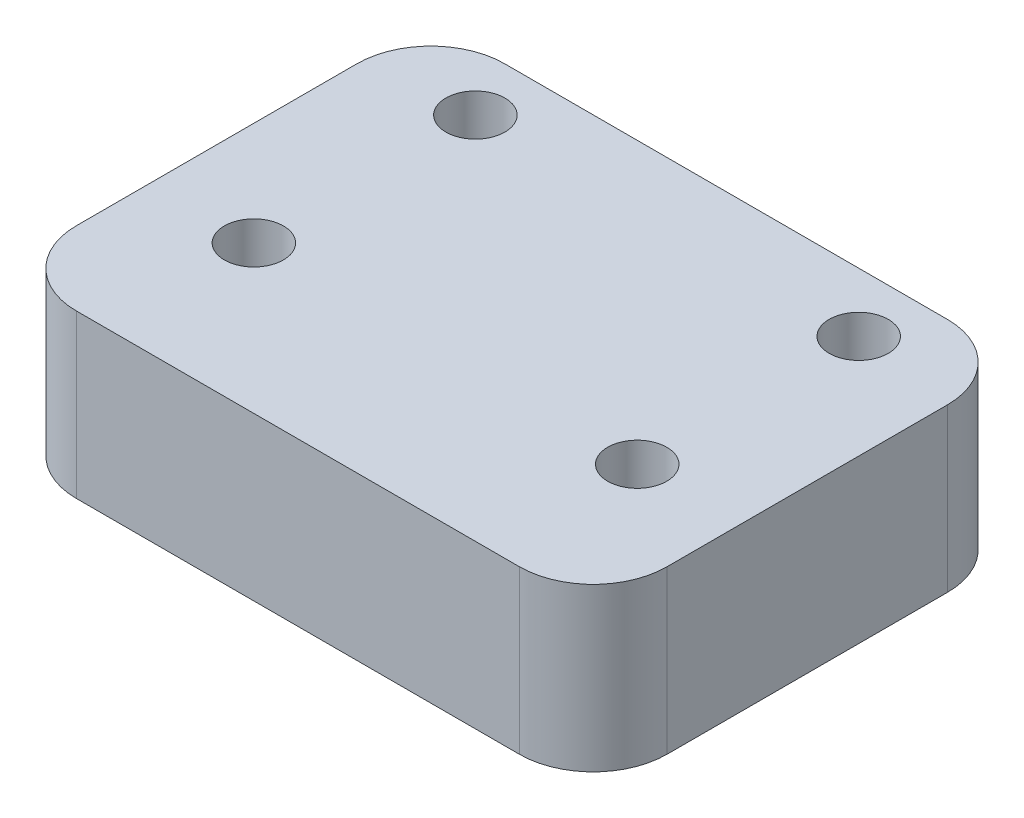
ISO-10303-21;
HEADER;
FILE_DESCRIPTION(('STEP AP214'),'2;1');
FILE_NAME('part.step','',(''),(''),'','','');
FILE_SCHEMA(('AUTOMOTIVE_DESIGN { 1 0 10303 214 1 1 1 1 }'));
ENDSEC;
DATA;
#1=APPLICATION_CONTEXT('core data for automotive mechanical design processes');
#2=APPLICATION_PROTOCOL_DEFINITION('international standard','automotive_design',2000,#1);
#3=PRODUCT_CONTEXT('',#1,'mechanical');
#4=PRODUCT('Part','Part','',(#3));
#5=PRODUCT_RELATED_PRODUCT_CATEGORY('part','',(#4));
#6=PRODUCT_DEFINITION_FORMATION('','',#4);
#7=PRODUCT_DEFINITION_CONTEXT('part definition',#1,'design');
#8=PRODUCT_DEFINITION('design','',#6,#7);
#9=PRODUCT_DEFINITION_SHAPE('','',#8);
#10=(LENGTH_UNIT() NAMED_UNIT(*) SI_UNIT(.MILLI.,.METRE.));
#11=(NAMED_UNIT(*) PLANE_ANGLE_UNIT() SI_UNIT($,.RADIAN.));
#12=(NAMED_UNIT(*) SI_UNIT($,.STERADIAN.) SOLID_ANGLE_UNIT());
#13=UNCERTAINTY_MEASURE_WITH_UNIT(LENGTH_MEASURE(1.E-05),#10,'distance_accuracy_value','');
#14=(GEOMETRIC_REPRESENTATION_CONTEXT(3) GLOBAL_UNCERTAINTY_ASSIGNED_CONTEXT((#13)) GLOBAL_UNIT_ASSIGNED_CONTEXT((#10,
#11,#12)) REPRESENTATION_CONTEXT('',''));
#15=CARTESIAN_POINT('',(0.,0.,0.));
#16=DIRECTION('',(0.,0.,1.));
#17=DIRECTION('',(1.,0.,0.));
#18=AXIS2_PLACEMENT_3D('',#15,#16,#17);
#19=CARTESIAN_POINT('',(0.,11.,0.));
#20=DIRECTION('',(0.,1.,0.));
#21=DIRECTION('',(0.,0.,1.));
#22=AXIS2_PLACEMENT_3D('',#19,#20,#21);
#23=PLANE('',#22);
#24=CARTESIAN_POINT('',(-12.98,11.,4.50000000000001));
#25=DIRECTION('',(0.,1.,0.));
#26=DIRECTION('',(0.,0.,1.));
#27=AXIS2_PLACEMENT_3D('',#24,#25,#26);
#28=CIRCLE('',#27,2.);
#29=CARTESIAN_POINT('',(-12.98,11.,6.50000000000001));
#30=VERTEX_POINT('',#29);
#31=EDGE_CURVE('E180',#30,#30,#28,.T.);
#32=ORIENTED_EDGE('',*,*,#31,.F.);
#33=EDGE_LOOP('',(#32));
#34=FACE_BOUND('',#33,.T.);
#35=CARTESIAN_POINT('',(12.98,11.,-10.5));
#36=DIRECTION('',(0.,1.,0.));
#37=DIRECTION('',(0.,0.,1.));
#38=AXIS2_PLACEMENT_3D('',#35,#36,#37);
#39=CIRCLE('',#38,2.);
#40=CARTESIAN_POINT('',(12.98,11.,-8.49999999999999));
#41=VERTEX_POINT('',#40);
#42=EDGE_CURVE('E163',#41,#41,#39,.T.);
#43=ORIENTED_EDGE('',*,*,#42,.F.);
#44=EDGE_LOOP('',(#43));
#45=FACE_BOUND('',#44,.T.);
#46=DIRECTION('',(0.,0.,1.));
#47=VECTOR('',#46,1.);
#48=CARTESIAN_POINT('',(-20.,11.,-14.5));
#49=LINE('',#48,#47);
#50=CARTESIAN_POINT('',(-20.,11.,-9.5));
#51=VERTEX_POINT('',#50);
#52=CARTESIAN_POINT('',(-20.,11.,9.49999999999999));
#53=VERTEX_POINT('',#52);
#54=EDGE_CURVE('E167',#51,#53,#49,.T.);
#55=ORIENTED_EDGE('',*,*,#54,.T.);
#56=CARTESIAN_POINT('',(-15.,11.,9.5));
#57=DIRECTION('',(0.,1.,0.));
#58=DIRECTION('',(0.,0.,1.));
#59=AXIS2_PLACEMENT_3D('',#56,#57,#58);
#60=CIRCLE('',#59,5.);
#61=CARTESIAN_POINT('',(-15.,11.,14.5));
#62=VERTEX_POINT('',#61);
#63=EDGE_CURVE('E150',#53,#62,#60,.T.);
#64=ORIENTED_EDGE('',*,*,#63,.T.);
#65=DIRECTION('',(1.,0.,0.));
#66=VECTOR('',#65,1.);
#67=CARTESIAN_POINT('',(-20.,11.,14.5));
#68=LINE('',#67,#66);
#69=CARTESIAN_POINT('',(15.,11.,14.5));
#70=VERTEX_POINT('',#69);
#71=EDGE_CURVE('E121',#62,#70,#68,.T.);
#72=ORIENTED_EDGE('',*,*,#71,.T.);
#73=CARTESIAN_POINT('',(15.,11.,9.5));
#74=DIRECTION('',(0.,1.,0.));
#75=DIRECTION('',(0.,0.,1.));
#76=AXIS2_PLACEMENT_3D('',#73,#74,#75);
#77=CIRCLE('',#76,5.);
#78=CARTESIAN_POINT('',(20.,11.,9.49999999999999));
#79=VERTEX_POINT('',#78);
#80=EDGE_CURVE('E148',#70,#79,#77,.T.);
#81=ORIENTED_EDGE('',*,*,#80,.T.);
#82=DIRECTION('',(0.,0.,-1.));
#83=VECTOR('',#82,1.);
#84=CARTESIAN_POINT('',(20.,11.,-14.5));
#85=LINE('',#84,#83);
#86=CARTESIAN_POINT('',(20.,11.,-9.5));
#87=VERTEX_POINT('',#86);
#88=EDGE_CURVE('E128',#79,#87,#85,.T.);
#89=ORIENTED_EDGE('',*,*,#88,.T.);
#90=CARTESIAN_POINT('',(15.,11.,-9.5));
#91=DIRECTION('',(0.,1.,0.));
#92=DIRECTION('',(0.,0.,1.));
#93=AXIS2_PLACEMENT_3D('',#90,#91,#92);
#94=CIRCLE('',#93,5.);
#95=CARTESIAN_POINT('',(15.,11.,-14.5));
#96=VERTEX_POINT('',#95);
#97=EDGE_CURVE('E56',#87,#96,#94,.T.);
#98=ORIENTED_EDGE('',*,*,#97,.T.);
#99=DIRECTION('',(-1.,0.,0.));
#100=VECTOR('',#99,1.);
#101=CARTESIAN_POINT('',(-20.,11.,-14.5));
#102=LINE('',#101,#100);
#103=CARTESIAN_POINT('',(-15.,11.,-14.5));
#104=VERTEX_POINT('',#103);
#105=EDGE_CURVE('E131',#96,#104,#102,.T.);
#106=ORIENTED_EDGE('',*,*,#105,.T.);
#107=CARTESIAN_POINT('',(-15.,11.,-9.5));
#108=DIRECTION('',(0.,1.,0.));
#109=DIRECTION('',(0.,0.,1.));
#110=AXIS2_PLACEMENT_3D('',#107,#108,#109);
#111=CIRCLE('',#110,5.);
#112=EDGE_CURVE('E146',#104,#51,#111,.T.);
#113=ORIENTED_EDGE('',*,*,#112,.T.);
#114=EDGE_LOOP('',(#55,#64,#72,#81,#89,#98,#106,#113));
#115=FACE_BOUND('',#114,.T.);
#116=CARTESIAN_POINT('',(-12.98,11.,-10.5));
#117=DIRECTION('',(0.,1.,0.));
#118=DIRECTION('',(0.,0.,1.));
#119=AXIS2_PLACEMENT_3D('',#116,#117,#118);
#120=CIRCLE('',#119,2.);
#121=CARTESIAN_POINT('',(-12.98,11.,-8.49999999999999));
#122=VERTEX_POINT('',#121);
#123=EDGE_CURVE('E174',#122,#122,#120,.T.);
#124=ORIENTED_EDGE('',*,*,#123,.F.);
#125=EDGE_LOOP('',(#124));
#126=FACE_BOUND('',#125,.T.);
#127=CARTESIAN_POINT('',(12.98,11.,4.50000000000001));
#128=DIRECTION('',(0.,1.,0.));
#129=DIRECTION('',(0.,0.,1.));
#130=AXIS2_PLACEMENT_3D('',#127,#128,#129);
#131=CIRCLE('',#130,2.);
#132=CARTESIAN_POINT('',(12.98,11.,6.50000000000001));
#133=VERTEX_POINT('',#132);
#134=EDGE_CURVE('E186',#133,#133,#131,.T.);
#135=ORIENTED_EDGE('',*,*,#134,.F.);
#136=EDGE_LOOP('',(#135));
#137=FACE_BOUND('',#136,.T.);
#138=ADVANCED_FACE('F36',(#34,#45,#115,#126,#137),#23,.T.);
#139=CARTESIAN_POINT('',(0.,0.,0.));
#140=DIRECTION('',(0.,1.,0.));
#141=DIRECTION('',(0.,0.,1.));
#142=AXIS2_PLACEMENT_3D('',#139,#140,#141);
#143=PLANE('',#142);
#144=DIRECTION('',(1.,0.,0.));
#145=VECTOR('',#144,1.);
#146=CARTESIAN_POINT('',(-20.,0.,14.5));
#147=LINE('',#146,#145);
#148=CARTESIAN_POINT('',(-15.,0.,14.5));
#149=VERTEX_POINT('',#148);
#150=CARTESIAN_POINT('',(15.,0.,14.5));
#151=VERTEX_POINT('',#150);
#152=EDGE_CURVE('E118',#149,#151,#147,.T.);
#153=ORIENTED_EDGE('',*,*,#152,.F.);
#154=CARTESIAN_POINT('',(-15.,0.,9.5));
#155=DIRECTION('',(0.,1.,0.));
#156=DIRECTION('',(0.,0.,1.));
#157=AXIS2_PLACEMENT_3D('',#154,#155,#156);
#158=CIRCLE('',#157,5.);
#159=CARTESIAN_POINT('',(-20.,0.,9.49999999999999));
#160=VERTEX_POINT('',#159);
#161=EDGE_CURVE('E101',#149,#160,#158,.F.);
#162=ORIENTED_EDGE('',*,*,#161,.T.);
#163=DIRECTION('',(0.,0.,1.));
#164=VECTOR('',#163,1.);
#165=CARTESIAN_POINT('',(-20.,0.,-14.5));
#166=LINE('',#165,#164);
#167=CARTESIAN_POINT('',(-20.,0.,-9.5));
#168=VERTEX_POINT('',#167);
#169=EDGE_CURVE('E129',#168,#160,#166,.T.);
#170=ORIENTED_EDGE('',*,*,#169,.F.);
#171=CARTESIAN_POINT('',(-15.,0.,-9.5));
#172=DIRECTION('',(0.,1.,0.));
#173=DIRECTION('',(0.,0.,1.));
#174=AXIS2_PLACEMENT_3D('',#171,#172,#173);
#175=CIRCLE('',#174,5.);
#176=CARTESIAN_POINT('',(-15.,0.,-14.5));
#177=VERTEX_POINT('',#176);
#178=EDGE_CURVE('E139',#168,#177,#175,.F.);
#179=ORIENTED_EDGE('',*,*,#178,.T.);
#180=DIRECTION('',(-1.,0.,0.));
#181=VECTOR('',#180,1.);
#182=CARTESIAN_POINT('',(-20.,0.,-14.5));
#183=LINE('',#182,#181);
#184=CARTESIAN_POINT('',(15.,0.,-14.5));
#185=VERTEX_POINT('',#184);
#186=EDGE_CURVE('E133',#185,#177,#183,.T.);
#187=ORIENTED_EDGE('',*,*,#186,.F.);
#188=CARTESIAN_POINT('',(15.,0.,-9.5));
#189=DIRECTION('',(0.,1.,0.));
#190=DIRECTION('',(0.,0.,1.));
#191=AXIS2_PLACEMENT_3D('',#188,#189,#190);
#192=CIRCLE('',#191,5.);
#193=CARTESIAN_POINT('',(20.,0.,-9.5));
#194=VERTEX_POINT('',#193);
#195=EDGE_CURVE('E122',#185,#194,#192,.F.);
#196=ORIENTED_EDGE('',*,*,#195,.T.);
#197=DIRECTION('',(0.,0.,-1.));
#198=VECTOR('',#197,1.);
#199=CARTESIAN_POINT('',(20.,0.,-14.5));
#200=LINE('',#199,#198);
#201=CARTESIAN_POINT('',(20.,0.,9.49999999999999));
#202=VERTEX_POINT('',#201);
#203=EDGE_CURVE('E162',#202,#194,#200,.T.);
#204=ORIENTED_EDGE('',*,*,#203,.F.);
#205=CARTESIAN_POINT('',(15.,0.,9.5));
#206=DIRECTION('',(0.,1.,0.));
#207=DIRECTION('',(0.,0.,1.));
#208=AXIS2_PLACEMENT_3D('',#205,#206,#207);
#209=CIRCLE('',#208,5.);
#210=EDGE_CURVE('E112',#202,#151,#209,.F.);
#211=ORIENTED_EDGE('',*,*,#210,.T.);
#212=EDGE_LOOP('',(#153,#162,#170,#179,#187,#196,#204,#211));
#213=FACE_BOUND('',#212,.T.);
#214=CARTESIAN_POINT('',(12.98,0.,-10.5));
#215=DIRECTION('',(0.,1.,0.));
#216=DIRECTION('',(0.,0.,1.));
#217=AXIS2_PLACEMENT_3D('',#214,#215,#216);
#218=CIRCLE('',#217,2.);
#219=CARTESIAN_POINT('',(12.98,0.,-8.49999999999999));
#220=VERTEX_POINT('',#219);
#221=EDGE_CURVE('E171',#220,#220,#218,.T.);
#222=ORIENTED_EDGE('',*,*,#221,.T.);
#223=EDGE_LOOP('',(#222));
#224=FACE_BOUND('',#223,.T.);
#225=CARTESIAN_POINT('',(-12.98,0.,-10.5));
#226=DIRECTION('',(0.,1.,0.));
#227=DIRECTION('',(0.,0.,1.));
#228=AXIS2_PLACEMENT_3D('',#225,#226,#227);
#229=CIRCLE('',#228,2.);
#230=CARTESIAN_POINT('',(-12.98,0.,-8.49999999999999));
#231=VERTEX_POINT('',#230);
#232=EDGE_CURVE('E177',#231,#231,#229,.T.);
#233=ORIENTED_EDGE('',*,*,#232,.T.);
#234=EDGE_LOOP('',(#233));
#235=FACE_BOUND('',#234,.T.);
#236=CARTESIAN_POINT('',(-12.98,0.,4.50000000000001));
#237=DIRECTION('',(0.,1.,0.));
#238=DIRECTION('',(0.,0.,1.));
#239=AXIS2_PLACEMENT_3D('',#236,#237,#238);
#240=CIRCLE('',#239,2.);
#241=CARTESIAN_POINT('',(-12.98,0.,6.50000000000001));
#242=VERTEX_POINT('',#241);
#243=EDGE_CURVE('E183',#242,#242,#240,.T.);
#244=ORIENTED_EDGE('',*,*,#243,.T.);
#245=EDGE_LOOP('',(#244));
#246=FACE_BOUND('',#245,.T.);
#247=CARTESIAN_POINT('',(12.98,0.,4.50000000000001));
#248=DIRECTION('',(0.,1.,0.));
#249=DIRECTION('',(0.,0.,1.));
#250=AXIS2_PLACEMENT_3D('',#247,#248,#249);
#251=CIRCLE('',#250,2.);
#252=CARTESIAN_POINT('',(12.98,0.,6.50000000000001));
#253=VERTEX_POINT('',#252);
#254=EDGE_CURVE('E189',#253,#253,#251,.T.);
#255=ORIENTED_EDGE('',*,*,#254,.T.);
#256=EDGE_LOOP('',(#255));
#257=FACE_BOUND('',#256,.T.);
#258=ADVANCED_FACE('F125',(#213,#224,#235,#246,#257),#143,.F.);
#259=CARTESIAN_POINT('',(20.,11.,-14.5));
#260=DIRECTION('',(-1.,0.,0.));
#261=DIRECTION('',(0.,0.,1.));
#262=AXIS2_PLACEMENT_3D('',#259,#260,#261);
#263=PLANE('',#262);
#264=ORIENTED_EDGE('',*,*,#88,.F.);
#265=DIRECTION('',(0.,-1.,0.));
#266=VECTOR('',#265,1.);
#267=CARTESIAN_POINT('',(20.,11.,9.5));
#268=LINE('',#267,#266);
#269=EDGE_CURVE('E154',#79,#202,#268,.T.);
#270=ORIENTED_EDGE('',*,*,#269,.T.);
#271=ORIENTED_EDGE('',*,*,#203,.T.);
#272=DIRECTION('',(0.,-1.,0.));
#273=VECTOR('',#272,1.);
#274=CARTESIAN_POINT('',(20.,11.,-9.5));
#275=LINE('',#274,#273);
#276=EDGE_CURVE('E152',#194,#87,#275,.F.);
#277=ORIENTED_EDGE('',*,*,#276,.T.);
#278=EDGE_LOOP('',(#264,#270,#271,#277));
#279=FACE_BOUND('',#278,.T.);
#280=ADVANCED_FACE('F204',(#279),#263,.F.);
#281=CARTESIAN_POINT('',(-20.,11.,-14.5));
#282=DIRECTION('',(0.,0.,1.));
#283=DIRECTION('',(1.,0.,0.));
#284=AXIS2_PLACEMENT_3D('',#281,#282,#283);
#285=PLANE('',#284);
#286=ORIENTED_EDGE('',*,*,#186,.T.);
#287=DIRECTION('',(0.,-1.,0.));
#288=VECTOR('',#287,1.);
#289=CARTESIAN_POINT('',(-15.,11.,-14.5));
#290=LINE('',#289,#288);
#291=EDGE_CURVE('E11',#177,#104,#290,.F.);
#292=ORIENTED_EDGE('',*,*,#291,.T.);
#293=ORIENTED_EDGE('',*,*,#105,.F.);
#294=DIRECTION('',(0.,-1.,0.));
#295=VECTOR('',#294,1.);
#296=CARTESIAN_POINT('',(15.,11.,-14.5));
#297=LINE('',#296,#295);
#298=EDGE_CURVE('E44',#96,#185,#297,.T.);
#299=ORIENTED_EDGE('',*,*,#298,.T.);
#300=EDGE_LOOP('',(#286,#292,#293,#299));
#301=FACE_BOUND('',#300,.T.);
#302=ADVANCED_FACE('F159',(#301),#285,.F.);
#303=CARTESIAN_POINT('',(-20.,11.,-14.5));
#304=DIRECTION('',(1.,0.,0.));
#305=DIRECTION('',(0.,0.,-1.));
#306=AXIS2_PLACEMENT_3D('',#303,#304,#305);
#307=PLANE('',#306);
#308=ORIENTED_EDGE('',*,*,#169,.T.);
#309=DIRECTION('',(0.,-1.,0.));
#310=VECTOR('',#309,1.);
#311=CARTESIAN_POINT('',(-20.,11.,9.5));
#312=LINE('',#311,#310);
#313=EDGE_CURVE('E106',#160,#53,#312,.F.);
#314=ORIENTED_EDGE('',*,*,#313,.T.);
#315=ORIENTED_EDGE('',*,*,#54,.F.);
#316=DIRECTION('',(0.,-1.,0.));
#317=VECTOR('',#316,1.);
#318=CARTESIAN_POINT('',(-20.,11.,-9.5));
#319=LINE('',#318,#317);
#320=EDGE_CURVE('E111',#51,#168,#319,.T.);
#321=ORIENTED_EDGE('',*,*,#320,.T.);
#322=EDGE_LOOP('',(#308,#314,#315,#321));
#323=FACE_BOUND('',#322,.T.);
#324=ADVANCED_FACE('F214',(#323),#307,.F.);
#325=CARTESIAN_POINT('',(-20.,11.,14.5));
#326=DIRECTION('',(0.,0.,-1.));
#327=DIRECTION('',(-1.,0.,0.));
#328=AXIS2_PLACEMENT_3D('',#325,#326,#327);
#329=PLANE('',#328);
#330=ORIENTED_EDGE('',*,*,#71,.F.);
#331=DIRECTION('',(0.,-1.,0.));
#332=VECTOR('',#331,1.);
#333=CARTESIAN_POINT('',(-15.,11.,14.5));
#334=LINE('',#333,#332);
#335=EDGE_CURVE('E105',#62,#149,#334,.T.);
#336=ORIENTED_EDGE('',*,*,#335,.T.);
#337=ORIENTED_EDGE('',*,*,#152,.T.);
#338=DIRECTION('',(0.,-1.,0.));
#339=VECTOR('',#338,1.);
#340=CARTESIAN_POINT('',(15.,11.,14.5));
#341=LINE('',#340,#339);
#342=EDGE_CURVE('E123',#151,#70,#341,.F.);
#343=ORIENTED_EDGE('',*,*,#342,.T.);
#344=EDGE_LOOP('',(#330,#336,#337,#343));
#345=FACE_BOUND('',#344,.T.);
#346=ADVANCED_FACE('F117',(#345),#329,.F.);
#347=CARTESIAN_POINT('',(12.98,11.,-10.5));
#348=DIRECTION('',(0.,-1.,0.));
#349=DIRECTION('',(0.,0.,-1.));
#350=AXIS2_PLACEMENT_3D('',#347,#348,#349);
#351=CYLINDRICAL_SURFACE('',#350,2.);
#352=ORIENTED_EDGE('',*,*,#42,.T.);
#353=EDGE_LOOP('',(#352));
#354=FACE_BOUND('',#353,.T.);
#355=ORIENTED_EDGE('',*,*,#221,.F.);
#356=EDGE_LOOP('',(#355));
#357=FACE_BOUND('',#356,.T.);
#358=ADVANCED_FACE('F209',(#354,#357),#351,.F.);
#359=CARTESIAN_POINT('',(-12.98,11.,-10.5));
#360=DIRECTION('',(0.,-1.,0.));
#361=DIRECTION('',(0.,0.,-1.));
#362=AXIS2_PLACEMENT_3D('',#359,#360,#361);
#363=CYLINDRICAL_SURFACE('',#362,2.);
#364=ORIENTED_EDGE('',*,*,#123,.T.);
#365=EDGE_LOOP('',(#364));
#366=FACE_BOUND('',#365,.T.);
#367=ORIENTED_EDGE('',*,*,#232,.F.);
#368=EDGE_LOOP('',(#367));
#369=FACE_BOUND('',#368,.T.);
#370=ADVANCED_FACE('F244',(#366,#369),#363,.F.);
#371=CARTESIAN_POINT('',(-12.98,11.,4.50000000000001));
#372=DIRECTION('',(0.,-1.,0.));
#373=DIRECTION('',(0.,0.,-1.));
#374=AXIS2_PLACEMENT_3D('',#371,#372,#373);
#375=CYLINDRICAL_SURFACE('',#374,2.);
#376=ORIENTED_EDGE('',*,*,#31,.T.);
#377=EDGE_LOOP('',(#376));
#378=FACE_BOUND('',#377,.T.);
#379=ORIENTED_EDGE('',*,*,#243,.F.);
#380=EDGE_LOOP('',(#379));
#381=FACE_BOUND('',#380,.T.);
#382=ADVANCED_FACE('F247',(#378,#381),#375,.F.);
#383=CARTESIAN_POINT('',(12.98,11.,4.50000000000001));
#384=DIRECTION('',(0.,-1.,0.));
#385=DIRECTION('',(0.,0.,-1.));
#386=AXIS2_PLACEMENT_3D('',#383,#384,#385);
#387=CYLINDRICAL_SURFACE('',#386,2.);
#388=ORIENTED_EDGE('',*,*,#134,.T.);
#389=EDGE_LOOP('',(#388));
#390=FACE_BOUND('',#389,.T.);
#391=ORIENTED_EDGE('',*,*,#254,.F.);
#392=EDGE_LOOP('',(#391));
#393=FACE_BOUND('',#392,.T.);
#394=ADVANCED_FACE('F195',(#390,#393),#387,.F.);
#395=CARTESIAN_POINT('',(-15.,11.,9.5));
#396=DIRECTION('',(0.,-1.,0.));
#397=DIRECTION('',(0.,0.,-1.));
#398=AXIS2_PLACEMENT_3D('',#395,#396,#397);
#399=CYLINDRICAL_SURFACE('',#398,5.);
#400=ORIENTED_EDGE('',*,*,#63,.F.);
#401=ORIENTED_EDGE('',*,*,#313,.F.);
#402=ORIENTED_EDGE('',*,*,#161,.F.);
#403=ORIENTED_EDGE('',*,*,#335,.F.);
#404=EDGE_LOOP('',(#400,#401,#402,#403));
#405=FACE_BOUND('',#404,.T.);
#406=ADVANCED_FACE('F104',(#405),#399,.T.);
#407=CARTESIAN_POINT('',(15.,11.,9.5));
#408=DIRECTION('',(0.,-1.,0.));
#409=DIRECTION('',(0.,0.,-1.));
#410=AXIS2_PLACEMENT_3D('',#407,#408,#409);
#411=CYLINDRICAL_SURFACE('',#410,5.);
#412=ORIENTED_EDGE('',*,*,#80,.F.);
#413=ORIENTED_EDGE('',*,*,#342,.F.);
#414=ORIENTED_EDGE('',*,*,#210,.F.);
#415=ORIENTED_EDGE('',*,*,#269,.F.);
#416=EDGE_LOOP('',(#412,#413,#414,#415));
#417=FACE_BOUND('',#416,.T.);
#418=ADVANCED_FACE('F225',(#417),#411,.T.);
#419=CARTESIAN_POINT('',(-15.,11.,-9.5));
#420=DIRECTION('',(0.,-1.,0.));
#421=DIRECTION('',(0.,0.,-1.));
#422=AXIS2_PLACEMENT_3D('',#419,#420,#421);
#423=CYLINDRICAL_SURFACE('',#422,5.);
#424=ORIENTED_EDGE('',*,*,#112,.F.);
#425=ORIENTED_EDGE('',*,*,#291,.F.);
#426=ORIENTED_EDGE('',*,*,#178,.F.);
#427=ORIENTED_EDGE('',*,*,#320,.F.);
#428=EDGE_LOOP('',(#424,#425,#426,#427));
#429=FACE_BOUND('',#428,.T.);
#430=ADVANCED_FACE('F227',(#429),#423,.T.);
#431=CARTESIAN_POINT('',(15.,11.,-9.5));
#432=DIRECTION('',(0.,-1.,0.));
#433=DIRECTION('',(0.,0.,-1.));
#434=AXIS2_PLACEMENT_3D('',#431,#432,#433);
#435=CYLINDRICAL_SURFACE('',#434,5.);
#436=ORIENTED_EDGE('',*,*,#97,.F.);
#437=ORIENTED_EDGE('',*,*,#276,.F.);
#438=ORIENTED_EDGE('',*,*,#195,.F.);
#439=ORIENTED_EDGE('',*,*,#298,.F.);
#440=EDGE_LOOP('',(#436,#437,#438,#439));
#441=FACE_BOUND('',#440,.T.);
#442=ADVANCED_FACE('F38',(#441),#435,.T.);
#443=CLOSED_SHELL('',(#138,#258,#280,#302,#324,#346,#358,#370,#382,#394,#406,#418,#430,#442));
#444=MANIFOLD_SOLID_BREP('B2',#443);
#445=ADVANCED_BREP_SHAPE_REPRESENTATION('',(#18,#444),#14);
#446=SHAPE_DEFINITION_REPRESENTATION(#9,#445);
ENDSEC;
END-ISO-10303-21;
